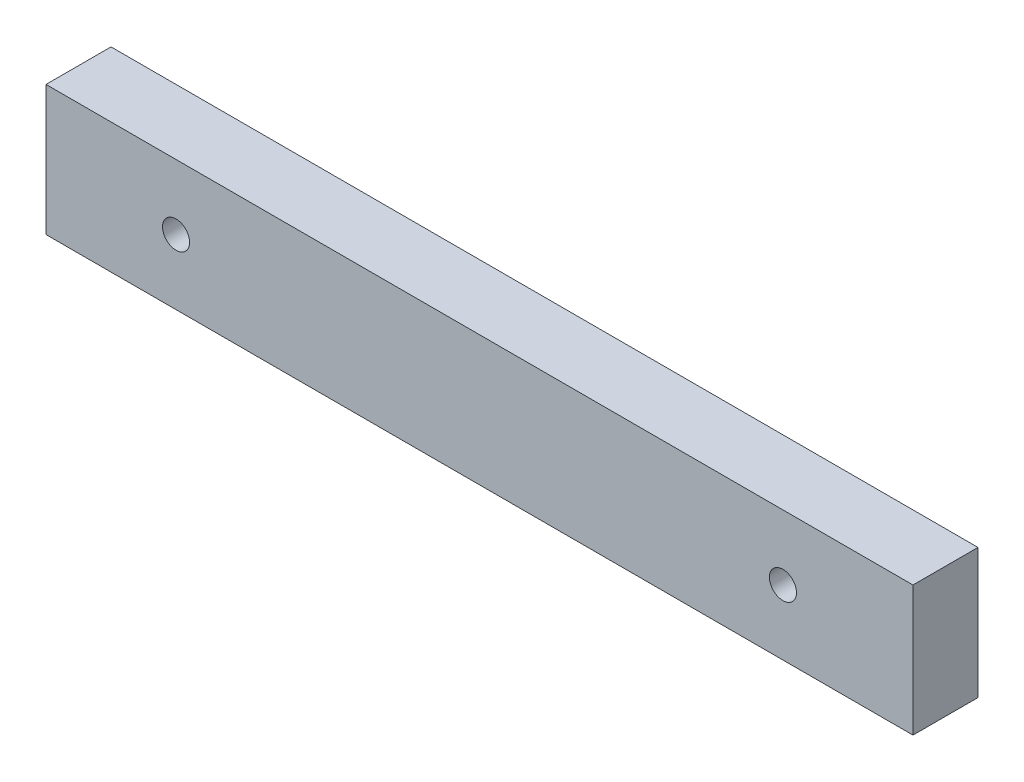
ISO-10303-21;
HEADER;
FILE_DESCRIPTION(('STEP AP214'),'2;1');
FILE_NAME('part.step','',(''),(''),'','','');
FILE_SCHEMA(('AUTOMOTIVE_DESIGN { 1 0 10303 214 1 1 1 1 }'));
ENDSEC;
DATA;
#1=APPLICATION_CONTEXT('core data for automotive mechanical design processes');
#2=APPLICATION_PROTOCOL_DEFINITION('international standard','automotive_design',2000,#1);
#3=PRODUCT_CONTEXT('',#1,'mechanical');
#4=PRODUCT('Part','Part','',(#3));
#5=PRODUCT_RELATED_PRODUCT_CATEGORY('part','',(#4));
#6=PRODUCT_DEFINITION_FORMATION('','',#4);
#7=PRODUCT_DEFINITION_CONTEXT('part definition',#1,'design');
#8=PRODUCT_DEFINITION('design','',#6,#7);
#9=PRODUCT_DEFINITION_SHAPE('','',#8);
#10=(LENGTH_UNIT() NAMED_UNIT(*) SI_UNIT(.MILLI.,.METRE.));
#11=(NAMED_UNIT(*) PLANE_ANGLE_UNIT() SI_UNIT($,.RADIAN.));
#12=(NAMED_UNIT(*) SI_UNIT($,.STERADIAN.) SOLID_ANGLE_UNIT());
#13=UNCERTAINTY_MEASURE_WITH_UNIT(LENGTH_MEASURE(1.E-05),#10,'distance_accuracy_value','');
#14=(GEOMETRIC_REPRESENTATION_CONTEXT(3) GLOBAL_UNCERTAINTY_ASSIGNED_CONTEXT((#13)) GLOBAL_UNIT_ASSIGNED_CONTEXT((#10,
#11,#12)) REPRESENTATION_CONTEXT('',''));
#15=CARTESIAN_POINT('',(0.,0.,0.));
#16=DIRECTION('',(0.,0.,1.));
#17=DIRECTION('',(1.,0.,0.));
#18=AXIS2_PLACEMENT_3D('',#15,#16,#17);
#19=CARTESIAN_POINT('',(72.0479544735839,-12.8847187492063,19.05));
#20=DIRECTION('',(0.,1.,0.));
#21=DIRECTION('',(0.,0.,1.));
#22=AXIS2_PLACEMENT_3D('',#19,#20,#21);
#23=PLANE('',#22);
#24=DIRECTION('',(1.,0.,0.));
#25=VECTOR('',#24,1.);
#26=CARTESIAN_POINT('',(72.0479544735839,-12.8847187492063,0.));
#27=LINE('',#26,#25);
#28=CARTESIAN_POINT('',(-54.9520455264162,-12.8847187492063,0.));
#29=VERTEX_POINT('',#28);
#30=CARTESIAN_POINT('',(199.047954473584,-12.8847187492063,0.));
#31=VERTEX_POINT('',#30);
#32=EDGE_CURVE('E103',#29,#31,#27,.T.);
#33=ORIENTED_EDGE('',*,*,#32,.T.);
#34=DIRECTION('',(0.,0.,-1.));
#35=VECTOR('',#34,1.);
#36=CARTESIAN_POINT('',(199.047954473584,-12.8847187492063,19.05));
#37=LINE('',#36,#35);
#38=CARTESIAN_POINT('',(199.047954473584,-12.8847187492063,19.05));
#39=VERTEX_POINT('',#38);
#40=EDGE_CURVE('E11',#39,#31,#37,.T.);
#41=ORIENTED_EDGE('',*,*,#40,.F.);
#42=DIRECTION('',(1.,0.,0.));
#43=VECTOR('',#42,1.);
#44=CARTESIAN_POINT('',(72.0479544735839,-12.8847187492063,19.05));
#45=LINE('',#44,#43);
#46=CARTESIAN_POINT('',(-54.9520455264162,-12.8847187492063,19.05));
#47=VERTEX_POINT('',#46);
#48=EDGE_CURVE('E73',#47,#39,#45,.T.);
#49=ORIENTED_EDGE('',*,*,#48,.F.);
#50=DIRECTION('',(0.,0.,-1.));
#51=VECTOR('',#50,1.);
#52=CARTESIAN_POINT('',(-54.9520455264162,-12.8847187492063,19.05));
#53=LINE('',#52,#51);
#54=EDGE_CURVE('E102',#47,#29,#53,.T.);
#55=ORIENTED_EDGE('',*,*,#54,.T.);
#56=EDGE_LOOP('',(#33,#41,#49,#55));
#57=FACE_BOUND('',#56,.T.);
#58=ADVANCED_FACE('F34',(#57),#23,.F.);
#59=CARTESIAN_POINT('',(199.047954473584,-193.752024661113,19.05));
#60=DIRECTION('',(1.,0.,0.));
#61=DIRECTION('',(0.,0.,-1.));
#62=AXIS2_PLACEMENT_3D('',#59,#60,#61);
#63=PLANE('',#62);
#64=DIRECTION('',(0.,-1.,0.));
#65=VECTOR('',#64,1.);
#66=CARTESIAN_POINT('',(199.047954473584,-193.752024661113,0.));
#67=LINE('',#66,#65);
#68=CARTESIAN_POINT('',(199.047954473584,25.2152812507937,0.));
#69=VERTEX_POINT('',#68);
#70=EDGE_CURVE('E82',#69,#31,#67,.T.);
#71=ORIENTED_EDGE('',*,*,#70,.F.);
#72=DIRECTION('',(0.,0.,-1.));
#73=VECTOR('',#72,1.);
#74=CARTESIAN_POINT('',(199.047954473584,25.2152812507937,19.05));
#75=LINE('',#74,#73);
#76=CARTESIAN_POINT('',(199.047954473584,25.2152812507937,19.05));
#77=VERTEX_POINT('',#76);
#78=EDGE_CURVE('E42',#77,#69,#75,.T.);
#79=ORIENTED_EDGE('',*,*,#78,.F.);
#80=DIRECTION('',(0.,-1.,0.));
#81=VECTOR('',#80,1.);
#82=CARTESIAN_POINT('',(199.047954473584,-193.752024661113,19.05));
#83=LINE('',#82,#81);
#84=EDGE_CURVE('E80',#77,#39,#83,.T.);
#85=ORIENTED_EDGE('',*,*,#84,.T.);
#86=ORIENTED_EDGE('',*,*,#40,.T.);
#87=EDGE_LOOP('',(#71,#79,#85,#86));
#88=FACE_BOUND('',#87,.T.);
#89=ADVANCED_FACE('F79',(#88),#63,.T.);
#90=CARTESIAN_POINT('',(72.0479544735839,25.2152812507937,19.05));
#91=DIRECTION('',(0.,1.,0.));
#92=DIRECTION('',(0.,0.,1.));
#93=AXIS2_PLACEMENT_3D('',#90,#91,#92);
#94=PLANE('',#93);
#95=DIRECTION('',(1.,0.,0.));
#96=VECTOR('',#95,1.);
#97=CARTESIAN_POINT('',(72.0479544735839,25.2152812507937,0.));
#98=LINE('',#97,#96);
#99=CARTESIAN_POINT('',(-54.9520455264161,25.2152812507937,0.));
#100=VERTEX_POINT('',#99);
#101=EDGE_CURVE('E107',#100,#69,#98,.T.);
#102=ORIENTED_EDGE('',*,*,#101,.F.);
#103=DIRECTION('',(0.,0.,-1.));
#104=VECTOR('',#103,1.);
#105=CARTESIAN_POINT('',(-54.9520455264161,25.2152812507937,19.05));
#106=LINE('',#105,#104);
#107=CARTESIAN_POINT('',(-54.9520455264161,25.2152812507937,19.05));
#108=VERTEX_POINT('',#107);
#109=EDGE_CURVE('E65',#108,#100,#106,.T.);
#110=ORIENTED_EDGE('',*,*,#109,.F.);
#111=DIRECTION('',(1.,0.,0.));
#112=VECTOR('',#111,1.);
#113=CARTESIAN_POINT('',(72.0479544735839,25.2152812507937,19.05));
#114=LINE('',#113,#112);
#115=EDGE_CURVE('E89',#108,#77,#114,.T.);
#116=ORIENTED_EDGE('',*,*,#115,.T.);
#117=ORIENTED_EDGE('',*,*,#78,.T.);
#118=EDGE_LOOP('',(#102,#110,#116,#117));
#119=FACE_BOUND('',#118,.T.);
#120=ADVANCED_FACE('F91',(#119),#94,.T.);
#121=CARTESIAN_POINT('',(-16.8520455264161,6.16528125079373,19.05));
#122=DIRECTION('',(0.,0.,-1.));
#123=DIRECTION('',(-1.,0.,0.));
#124=AXIS2_PLACEMENT_3D('',#121,#122,#123);
#125=CYLINDRICAL_SURFACE('',#124,3.96875);
#126=CARTESIAN_POINT('',(-16.8520455264161,6.16528125079373,19.05));
#127=DIRECTION('',(0.,0.,1.));
#128=DIRECTION('',(1.,0.,0.));
#129=AXIS2_PLACEMENT_3D('',#126,#127,#128);
#130=CIRCLE('',#129,3.96875);
#131=CARTESIAN_POINT('',(-20.8207955264161,6.16528125079373,19.05));
#132=VERTEX_POINT('',#131);
#133=EDGE_CURVE('E93',#132,#132,#130,.T.);
#134=CARTESIAN_POINT('',(-16.8520455264161,6.16528125079373,0.));
#135=DIRECTION('',(0.,0.,1.));
#136=DIRECTION('',(1.,0.,0.));
#137=AXIS2_PLACEMENT_3D('',#134,#135,#136);
#138=CIRCLE('',#137,3.96875);
#139=CARTESIAN_POINT('',(-20.8207955264161,6.16528125079373,0.));
#140=VERTEX_POINT('',#139);
#141=EDGE_CURVE('E110',#140,#140,#138,.T.);
#142=CARTESIAN_POINT('',(-20.8207955264161,6.16528125079373,19.05));
#143=CARTESIAN_POINT('',(-20.8207955264161,6.16528125079373,18.8515625));
#144=CARTESIAN_POINT('',(-20.8207955264161,6.16528125079373,18.653125));
#145=CARTESIAN_POINT('',(-20.8207955264161,6.16528125079373,18.25625));
#146=CARTESIAN_POINT('',(-20.8207955264161,6.16528125079373,18.0578125));
#147=CARTESIAN_POINT('',(-20.8207955264161,6.16528125079373,17.6609375));
#148=CARTESIAN_POINT('',(-20.8207955264161,6.16528125079373,17.4625));
#149=CARTESIAN_POINT('',(-20.8207955264161,6.16528125079373,17.065625));
#150=CARTESIAN_POINT('',(-20.8207955264161,6.16528125079373,16.8671875));
#151=CARTESIAN_POINT('',(-20.8207955264161,6.16528125079373,16.4703125));
#152=CARTESIAN_POINT('',(-20.8207955264161,6.16528125079373,16.271875));
#153=CARTESIAN_POINT('',(-20.8207955264161,6.16528125079373,15.875));
#154=CARTESIAN_POINT('',(-20.8207955264161,6.16528125079373,15.6765625));
#155=CARTESIAN_POINT('',(-20.8207955264161,6.16528125079373,15.2796875));
#156=CARTESIAN_POINT('',(-20.8207955264161,6.16528125079373,15.08125));
#157=CARTESIAN_POINT('',(-20.8207955264161,6.16528125079373,14.684375));
#158=CARTESIAN_POINT('',(-20.8207955264161,6.16528125079373,14.4859375));
#159=CARTESIAN_POINT('',(-20.8207955264161,6.16528125079373,14.0890625));
#160=CARTESIAN_POINT('',(-20.8207955264161,6.16528125079373,13.890625));
#161=CARTESIAN_POINT('',(-20.8207955264161,6.16528125079373,13.49375));
#162=CARTESIAN_POINT('',(-20.8207955264161,6.16528125079373,13.2953125));
#163=CARTESIAN_POINT('',(-20.8207955264161,6.16528125079373,12.8984375));
#164=CARTESIAN_POINT('',(-20.8207955264161,6.16528125079373,12.7));
#165=CARTESIAN_POINT('',(-20.8207955264161,6.16528125079373,12.303125));
#166=CARTESIAN_POINT('',(-20.8207955264161,6.16528125079373,12.1046875));
#167=CARTESIAN_POINT('',(-20.8207955264161,6.16528125079373,11.7078125));
#168=CARTESIAN_POINT('',(-20.8207955264161,6.16528125079373,11.509375));
#169=CARTESIAN_POINT('',(-20.8207955264161,6.16528125079373,11.1125));
#170=CARTESIAN_POINT('',(-20.8207955264161,6.16528125079373,10.9140625));
#171=CARTESIAN_POINT('',(-20.8207955264161,6.16528125079373,10.5171875));
#172=CARTESIAN_POINT('',(-20.8207955264161,6.16528125079373,10.31875));
#173=CARTESIAN_POINT('',(-20.8207955264161,6.16528125079373,9.921875));
#174=CARTESIAN_POINT('',(-20.8207955264161,6.16528125079373,9.7234375));
#175=CARTESIAN_POINT('',(-20.8207955264161,6.16528125079373,9.3265625));
#176=CARTESIAN_POINT('',(-20.8207955264161,6.16528125079373,9.128125));
#177=CARTESIAN_POINT('',(-20.8207955264161,6.16528125079373,8.73125));
#178=CARTESIAN_POINT('',(-20.8207955264161,6.16528125079373,8.5328125));
#179=CARTESIAN_POINT('',(-20.8207955264161,6.16528125079373,8.1359375));
#180=CARTESIAN_POINT('',(-20.8207955264161,6.16528125079373,7.9375));
#181=CARTESIAN_POINT('',(-20.8207955264161,6.16528125079373,7.540625));
#182=CARTESIAN_POINT('',(-20.8207955264161,6.16528125079373,7.3421875));
#183=CARTESIAN_POINT('',(-20.8207955264161,6.16528125079373,6.9453125));
#184=CARTESIAN_POINT('',(-20.8207955264161,6.16528125079373,6.746875));
#185=CARTESIAN_POINT('',(-20.8207955264161,6.16528125079373,6.35));
#186=CARTESIAN_POINT('',(-20.8207955264161,6.16528125079373,6.1515625));
#187=CARTESIAN_POINT('',(-20.8207955264161,6.16528125079373,5.7546875));
#188=CARTESIAN_POINT('',(-20.8207955264161,6.16528125079373,5.55625));
#189=CARTESIAN_POINT('',(-20.8207955264161,6.16528125079373,5.159375));
#190=CARTESIAN_POINT('',(-20.8207955264161,6.16528125079373,4.9609375));
#191=CARTESIAN_POINT('',(-20.8207955264161,6.16528125079373,4.5640625));
#192=CARTESIAN_POINT('',(-20.8207955264161,6.16528125079373,4.365625));
#193=CARTESIAN_POINT('',(-20.8207955264161,6.16528125079373,3.96875));
#194=CARTESIAN_POINT('',(-20.8207955264161,6.16528125079373,3.7703125));
#195=CARTESIAN_POINT('',(-20.8207955264161,6.16528125079373,3.3734375));
#196=CARTESIAN_POINT('',(-20.8207955264161,6.16528125079373,3.175));
#197=CARTESIAN_POINT('',(-20.8207955264161,6.16528125079373,2.778125));
#198=CARTESIAN_POINT('',(-20.8207955264161,6.16528125079373,2.5796875));
#199=CARTESIAN_POINT('',(-20.8207955264161,6.16528125079373,2.1828125));
#200=CARTESIAN_POINT('',(-20.8207955264161,6.16528125079373,1.984375));
#201=CARTESIAN_POINT('',(-20.8207955264161,6.16528125079373,1.5875));
#202=CARTESIAN_POINT('',(-20.8207955264161,6.16528125079373,1.3890625));
#203=CARTESIAN_POINT('',(-20.8207955264161,6.16528125079373,0.992187500000001));
#204=CARTESIAN_POINT('',(-20.8207955264161,6.16528125079373,0.793750000000001));
#205=CARTESIAN_POINT('',(-20.8207955264161,6.16528125079373,0.396875));
#206=CARTESIAN_POINT('',(-20.8207955264161,6.16528125079373,0.1984375));
#207=CARTESIAN_POINT('',(-20.8207955264161,6.16528125079373,0.));
#208=B_SPLINE_CURVE_WITH_KNOTS('',3,(#142,#143,#144,#145,#146,#147,#148,#149,#150,#151,#152,
#153,#154,#155,#156,#157,#158,#159,#160,#161,#162,#163,#164,#165,#166,#167,#168,#169,#170,#171,
#172,#173,#174,#175,#176,#177,#178,#179,#180,#181,#182,#183,#184,#185,#186,#187,#188,#189,#190,
#191,#192,#193,#194,#195,#196,#197,#198,#199,#200,#201,#202,#203,#204,#205,#206,#207),
.UNSPECIFIED.,.F.,.F.,(4,2,2,2,2,2,2,2,2,2,2,2,2,2,2,2,2,2,2,2,2,2,2,2,2,2,2,2,2,2,2,2,4),(0.,
0.5953125,1.190625,1.7859375,2.38125,2.9765625,3.571875,4.1671875,4.7625,5.3578125,5.953125,
6.5484375,7.14375,7.7390625,8.334375,8.9296875,9.525,10.1203125,10.715625,11.3109375,11.90625,
12.5015625,13.096875,13.6921875,14.2875,14.8828125,15.478125,16.0734375,16.66875,17.2640625,
17.859375,18.4546875,19.05),.UNSPECIFIED.);
#209=EDGE_CURVE('BSEAM138',#132,#140,#208,.T.);
#210=ORIENTED_EDGE('',*,*,#133,.T.);
#211=ORIENTED_EDGE('',*,*,#141,.F.);
#212=ORIENTED_EDGE('',*,*,#209,.T.);
#213=ORIENTED_EDGE('',*,*,#209,.F.);
#214=EDGE_LOOP('',(#210,#212,#211,#213));
#215=FACE_BOUND('',#214,.T.);
#216=ADVANCED_FACE('F138',(#215),#125,.F.);
#217=CARTESIAN_POINT('',(-54.9520455264162,-193.752024661113,19.05));
#218=DIRECTION('',(1.,0.,0.));
#219=DIRECTION('',(0.,0.,-1.));
#220=AXIS2_PLACEMENT_3D('',#217,#218,#219);
#221=PLANE('',#220);
#222=DIRECTION('',(0.,-1.,0.));
#223=VECTOR('',#222,1.);
#224=CARTESIAN_POINT('',(-54.9520455264162,-193.752024661113,0.));
#225=LINE('',#224,#223);
#226=EDGE_CURVE('E68',#100,#29,#225,.T.);
#227=ORIENTED_EDGE('',*,*,#226,.T.);
#228=ORIENTED_EDGE('',*,*,#54,.F.);
#229=DIRECTION('',(0.,-1.,0.));
#230=VECTOR('',#229,1.);
#231=CARTESIAN_POINT('',(-54.9520455264162,-193.752024661113,19.05));
#232=LINE('',#231,#230);
#233=EDGE_CURVE('E50',#108,#47,#232,.T.);
#234=ORIENTED_EDGE('',*,*,#233,.F.);
#235=ORIENTED_EDGE('',*,*,#109,.T.);
#236=EDGE_LOOP('',(#227,#228,#234,#235));
#237=FACE_BOUND('',#236,.T.);
#238=ADVANCED_FACE('F130',(#237),#221,.F.);
#239=CARTESIAN_POINT('',(160.947954473584,6.16528125079373,19.05));
#240=DIRECTION('',(0.,0.,-1.));
#241=DIRECTION('',(-1.,0.,0.));
#242=AXIS2_PLACEMENT_3D('',#239,#240,#241);
#243=CYLINDRICAL_SURFACE('',#242,3.96874999999999);
#244=CARTESIAN_POINT('',(160.947954473584,6.16528125079373,19.05));
#245=DIRECTION('',(0.,0.,1.));
#246=DIRECTION('',(1.,0.,0.));
#247=AXIS2_PLACEMENT_3D('',#244,#245,#246);
#248=CIRCLE('',#247,3.96874999999999);
#249=CARTESIAN_POINT('',(156.979204473584,6.16528125079373,19.05));
#250=VERTEX_POINT('',#249);
#251=EDGE_CURVE('E99',#250,#250,#248,.T.);
#252=CARTESIAN_POINT('',(160.947954473584,6.16528125079373,0.));
#253=DIRECTION('',(0.,0.,1.));
#254=DIRECTION('',(1.,0.,0.));
#255=AXIS2_PLACEMENT_3D('',#252,#253,#254);
#256=CIRCLE('',#255,3.96874999999999);
#257=CARTESIAN_POINT('',(156.979204473584,6.16528125079373,0.));
#258=VERTEX_POINT('',#257);
#259=EDGE_CURVE('E113',#258,#258,#256,.T.);
#260=CARTESIAN_POINT('',(156.979204473584,6.16528125079373,19.05));
#261=CARTESIAN_POINT('',(156.979204473584,6.16528125079373,18.8515625));
#262=CARTESIAN_POINT('',(156.979204473584,6.16528125079373,18.653125));
#263=CARTESIAN_POINT('',(156.979204473584,6.16528125079373,18.25625));
#264=CARTESIAN_POINT('',(156.979204473584,6.16528125079373,18.0578125));
#265=CARTESIAN_POINT('',(156.979204473584,6.16528125079373,17.6609375));
#266=CARTESIAN_POINT('',(156.979204473584,6.16528125079373,17.4625));
#267=CARTESIAN_POINT('',(156.979204473584,6.16528125079373,17.065625));
#268=CARTESIAN_POINT('',(156.979204473584,6.16528125079373,16.8671875));
#269=CARTESIAN_POINT('',(156.979204473584,6.16528125079373,16.4703125));
#270=CARTESIAN_POINT('',(156.979204473584,6.16528125079373,16.271875));
#271=CARTESIAN_POINT('',(156.979204473584,6.16528125079373,15.875));
#272=CARTESIAN_POINT('',(156.979204473584,6.16528125079373,15.6765625));
#273=CARTESIAN_POINT('',(156.979204473584,6.16528125079373,15.2796875));
#274=CARTESIAN_POINT('',(156.979204473584,6.16528125079373,15.08125));
#275=CARTESIAN_POINT('',(156.979204473584,6.16528125079373,14.684375));
#276=CARTESIAN_POINT('',(156.979204473584,6.16528125079373,14.4859375));
#277=CARTESIAN_POINT('',(156.979204473584,6.16528125079373,14.0890625));
#278=CARTESIAN_POINT('',(156.979204473584,6.16528125079373,13.890625));
#279=CARTESIAN_POINT('',(156.979204473584,6.16528125079373,13.49375));
#280=CARTESIAN_POINT('',(156.979204473584,6.16528125079373,13.2953125));
#281=CARTESIAN_POINT('',(156.979204473584,6.16528125079373,12.8984375));
#282=CARTESIAN_POINT('',(156.979204473584,6.16528125079373,12.7));
#283=CARTESIAN_POINT('',(156.979204473584,6.16528125079373,12.303125));
#284=CARTESIAN_POINT('',(156.979204473584,6.16528125079373,12.1046875));
#285=CARTESIAN_POINT('',(156.979204473584,6.16528125079373,11.7078125));
#286=CARTESIAN_POINT('',(156.979204473584,6.16528125079373,11.509375));
#287=CARTESIAN_POINT('',(156.979204473584,6.16528125079373,11.1125));
#288=CARTESIAN_POINT('',(156.979204473584,6.16528125079373,10.9140625));
#289=CARTESIAN_POINT('',(156.979204473584,6.16528125079373,10.5171875));
#290=CARTESIAN_POINT('',(156.979204473584,6.16528125079373,10.31875));
#291=CARTESIAN_POINT('',(156.979204473584,6.16528125079373,9.921875));
#292=CARTESIAN_POINT('',(156.979204473584,6.16528125079373,9.7234375));
#293=CARTESIAN_POINT('',(156.979204473584,6.16528125079373,9.3265625));
#294=CARTESIAN_POINT('',(156.979204473584,6.16528125079373,9.128125));
#295=CARTESIAN_POINT('',(156.979204473584,6.16528125079373,8.73125));
#296=CARTESIAN_POINT('',(156.979204473584,6.16528125079373,8.5328125));
#297=CARTESIAN_POINT('',(156.979204473584,6.16528125079373,8.1359375));
#298=CARTESIAN_POINT('',(156.979204473584,6.16528125079373,7.9375));
#299=CARTESIAN_POINT('',(156.979204473584,6.16528125079373,7.540625));
#300=CARTESIAN_POINT('',(156.979204473584,6.16528125079373,7.3421875));
#301=CARTESIAN_POINT('',(156.979204473584,6.16528125079373,6.9453125));
#302=CARTESIAN_POINT('',(156.979204473584,6.16528125079373,6.746875));
#303=CARTESIAN_POINT('',(156.979204473584,6.16528125079373,6.35));
#304=CARTESIAN_POINT('',(156.979204473584,6.16528125079373,6.1515625));
#305=CARTESIAN_POINT('',(156.979204473584,6.16528125079373,5.7546875));
#306=CARTESIAN_POINT('',(156.979204473584,6.16528125079373,5.55625));
#307=CARTESIAN_POINT('',(156.979204473584,6.16528125079373,5.159375));
#308=CARTESIAN_POINT('',(156.979204473584,6.16528125079373,4.9609375));
#309=CARTESIAN_POINT('',(156.979204473584,6.16528125079373,4.5640625));
#310=CARTESIAN_POINT('',(156.979204473584,6.16528125079373,4.365625));
#311=CARTESIAN_POINT('',(156.979204473584,6.16528125079373,3.96875));
#312=CARTESIAN_POINT('',(156.979204473584,6.16528125079373,3.7703125));
#313=CARTESIAN_POINT('',(156.979204473584,6.16528125079373,3.3734375));
#314=CARTESIAN_POINT('',(156.979204473584,6.16528125079373,3.175));
#315=CARTESIAN_POINT('',(156.979204473584,6.16528125079373,2.778125));
#316=CARTESIAN_POINT('',(156.979204473584,6.16528125079373,2.5796875));
#317=CARTESIAN_POINT('',(156.979204473584,6.16528125079373,2.1828125));
#318=CARTESIAN_POINT('',(156.979204473584,6.16528125079373,1.984375));
#319=CARTESIAN_POINT('',(156.979204473584,6.16528125079373,1.5875));
#320=CARTESIAN_POINT('',(156.979204473584,6.16528125079373,1.3890625));
#321=CARTESIAN_POINT('',(156.979204473584,6.16528125079373,0.992187500000001));
#322=CARTESIAN_POINT('',(156.979204473584,6.16528125079373,0.793750000000001));
#323=CARTESIAN_POINT('',(156.979204473584,6.16528125079373,0.396875));
#324=CARTESIAN_POINT('',(156.979204473584,6.16528125079373,0.1984375));
#325=CARTESIAN_POINT('',(156.979204473584,6.16528125079373,0.));
#326=B_SPLINE_CURVE_WITH_KNOTS('',3,(#260,#261,#262,#263,#264,#265,#266,#267,#268,#269,#270,
#271,#272,#273,#274,#275,#276,#277,#278,#279,#280,#281,#282,#283,#284,#285,#286,#287,#288,#289,
#290,#291,#292,#293,#294,#295,#296,#297,#298,#299,#300,#301,#302,#303,#304,#305,#306,#307,#308,
#309,#310,#311,#312,#313,#314,#315,#316,#317,#318,#319,#320,#321,#322,#323,#324,#325),
.UNSPECIFIED.,.F.,.F.,(4,2,2,2,2,2,2,2,2,2,2,2,2,2,2,2,2,2,2,2,2,2,2,2,2,2,2,2,2,2,2,2,4),(0.,
0.5953125,1.190625,1.7859375,2.38125,2.9765625,3.571875,4.1671875,4.7625,5.3578125,5.953125,
6.5484375,7.14375,7.7390625,8.334375,8.9296875,9.525,10.1203125,10.715625,11.3109375,11.90625,
12.5015625,13.096875,13.6921875,14.2875,14.8828125,15.478125,16.0734375,16.66875,17.2640625,
17.859375,18.4546875,19.05),.UNSPECIFIED.);
#327=EDGE_CURVE('BSEAM128',#250,#258,#326,.T.);
#328=ORIENTED_EDGE('',*,*,#251,.T.);
#329=ORIENTED_EDGE('',*,*,#259,.F.);
#330=ORIENTED_EDGE('',*,*,#327,.T.);
#331=ORIENTED_EDGE('',*,*,#327,.F.);
#332=EDGE_LOOP('',(#328,#330,#329,#331));
#333=FACE_BOUND('',#332,.T.);
#334=ADVANCED_FACE('F128',(#333),#243,.F.);
#335=CARTESIAN_POINT('',(72.0479544735839,-193.752024661113,19.05));
#336=DIRECTION('',(0.,0.,1.));
#337=DIRECTION('',(1.,0.,0.));
#338=AXIS2_PLACEMENT_3D('',#335,#336,#337);
#339=PLANE('',#338);
#340=ORIENTED_EDGE('',*,*,#48,.T.);
#341=ORIENTED_EDGE('',*,*,#84,.F.);
#342=ORIENTED_EDGE('',*,*,#115,.F.);
#343=ORIENTED_EDGE('',*,*,#233,.T.);
#344=EDGE_LOOP('',(#340,#341,#342,#343));
#345=FACE_BOUND('',#344,.T.);
#346=ORIENTED_EDGE('',*,*,#133,.F.);
#347=EDGE_LOOP('',(#346));
#348=FACE_BOUND('',#347,.T.);
#349=ORIENTED_EDGE('',*,*,#251,.F.);
#350=EDGE_LOOP('',(#349));
#351=FACE_BOUND('',#350,.T.);
#352=ADVANCED_FACE('F87',(#345,#348,#351),#339,.T.);
#353=CARTESIAN_POINT('',(72.0479544735839,-193.752024661113,0.));
#354=DIRECTION('',(0.,0.,1.));
#355=DIRECTION('',(1.,0.,0.));
#356=AXIS2_PLACEMENT_3D('',#353,#354,#355);
#357=PLANE('',#356);
#358=ORIENTED_EDGE('',*,*,#32,.F.);
#359=ORIENTED_EDGE('',*,*,#226,.F.);
#360=ORIENTED_EDGE('',*,*,#101,.T.);
#361=ORIENTED_EDGE('',*,*,#70,.T.);
#362=EDGE_LOOP('',(#358,#359,#360,#361));
#363=FACE_BOUND('',#362,.T.);
#364=ORIENTED_EDGE('',*,*,#141,.T.);
#365=EDGE_LOOP('',(#364));
#366=FACE_BOUND('',#365,.T.);
#367=ORIENTED_EDGE('',*,*,#259,.T.);
#368=EDGE_LOOP('',(#367));
#369=FACE_BOUND('',#368,.T.);
#370=ADVANCED_FACE('F120',(#363,#366,#369),#357,.F.);
#371=CLOSED_SHELL('',(#58,#89,#120,#216,#238,#334,#352,#370));
#372=MANIFOLD_SOLID_BREP('B2',#371);
#373=ADVANCED_BREP_SHAPE_REPRESENTATION('',(#18,#372),#14);
#374=SHAPE_DEFINITION_REPRESENTATION(#9,#373);
ENDSEC;
END-ISO-10303-21;
